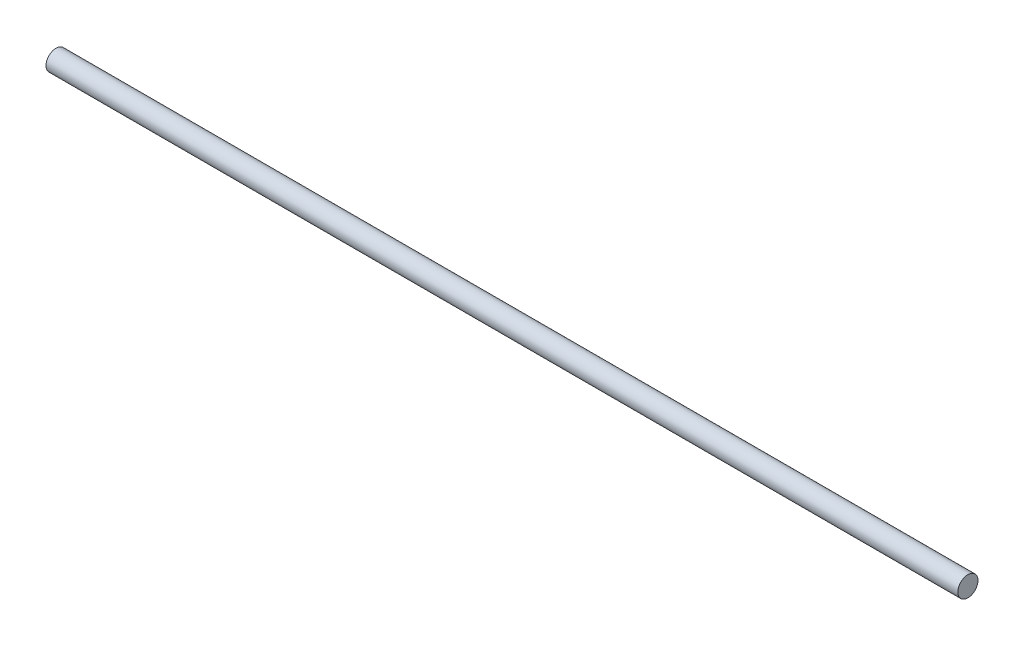
ISO-10303-21;
HEADER;
FILE_DESCRIPTION(('STEP AP214'),'2;1');
FILE_NAME('part.step','',(''),(''),'','','');
FILE_SCHEMA(('AUTOMOTIVE_DESIGN { 1 0 10303 214 1 1 1 1 }'));
ENDSEC;
DATA;
#1=APPLICATION_CONTEXT('core data for automotive mechanical design processes');
#2=APPLICATION_PROTOCOL_DEFINITION('international standard','automotive_design',2000,#1);
#3=PRODUCT_CONTEXT('',#1,'mechanical');
#4=PRODUCT('Part','Part','',(#3));
#5=PRODUCT_RELATED_PRODUCT_CATEGORY('part','',(#4));
#6=PRODUCT_DEFINITION_FORMATION('','',#4);
#7=PRODUCT_DEFINITION_CONTEXT('part definition',#1,'design');
#8=PRODUCT_DEFINITION('design','',#6,#7);
#9=PRODUCT_DEFINITION_SHAPE('','',#8);
#10=(LENGTH_UNIT() NAMED_UNIT(*) SI_UNIT(.MILLI.,.METRE.));
#11=(NAMED_UNIT(*) PLANE_ANGLE_UNIT() SI_UNIT($,.RADIAN.));
#12=(NAMED_UNIT(*) SI_UNIT($,.STERADIAN.) SOLID_ANGLE_UNIT());
#13=UNCERTAINTY_MEASURE_WITH_UNIT(LENGTH_MEASURE(1.E-05),#10,'distance_accuracy_value','');
#14=(GEOMETRIC_REPRESENTATION_CONTEXT(3) GLOBAL_UNCERTAINTY_ASSIGNED_CONTEXT((#13)) GLOBAL_UNIT_ASSIGNED_CONTEXT((#10,
#11,#12)) REPRESENTATION_CONTEXT('',''));
#15=CARTESIAN_POINT('',(0.,0.,0.));
#16=DIRECTION('',(0.,0.,1.));
#17=DIRECTION('',(1.,0.,0.));
#18=AXIS2_PLACEMENT_3D('',#15,#16,#17);
#19=CARTESIAN_POINT('',(181.,0.,0.));
#20=DIRECTION('',(-1.,0.,0.));
#21=DIRECTION('',(0.,0.,1.));
#22=AXIS2_PLACEMENT_3D('',#19,#20,#21);
#23=CYLINDRICAL_SURFACE('',#22,4.);
#24=CARTESIAN_POINT('',(181.,0.,0.));
#25=DIRECTION('',(1.,0.,0.));
#26=DIRECTION('',(0.,0.,-1.));
#27=AXIS2_PLACEMENT_3D('',#24,#25,#26);
#28=CIRCLE('',#27,4.);
#29=CARTESIAN_POINT('',(181.,0.,-4.));
#30=VERTEX_POINT('',#29);
#31=EDGE_CURVE('E10',#30,#30,#28,.T.);
#32=ORIENTED_EDGE('',*,*,#31,.F.);
#33=EDGE_LOOP('',(#32));
#34=FACE_BOUND('',#33,.T.);
#35=CARTESIAN_POINT('',(-181.,0.,0.));
#36=DIRECTION('',(1.,0.,0.));
#37=DIRECTION('',(0.,0.,-1.));
#38=AXIS2_PLACEMENT_3D('',#35,#36,#37);
#39=CIRCLE('',#38,4.);
#40=CARTESIAN_POINT('',(-181.,0.,-4.));
#41=VERTEX_POINT('',#40);
#42=EDGE_CURVE('E33',#41,#41,#39,.T.);
#43=ORIENTED_EDGE('',*,*,#42,.T.);
#44=EDGE_LOOP('',(#43));
#45=FACE_BOUND('',#44,.T.);
#46=ADVANCED_FACE('F30',(#34,#45),#23,.T.);
#47=CARTESIAN_POINT('',(181.,0.,0.));
#48=DIRECTION('',(1.,0.,0.));
#49=DIRECTION('',(0.,0.,-1.));
#50=AXIS2_PLACEMENT_3D('',#47,#48,#49);
#51=PLANE('',#50);
#52=ORIENTED_EDGE('',*,*,#31,.T.);
#53=EDGE_LOOP('',(#52));
#54=FACE_BOUND('',#53,.T.);
#55=ADVANCED_FACE('F45',(#54),#51,.T.);
#56=CARTESIAN_POINT('',(-181.,0.,0.));
#57=DIRECTION('',(1.,0.,0.));
#58=DIRECTION('',(0.,0.,-1.));
#59=AXIS2_PLACEMENT_3D('',#56,#57,#58);
#60=PLANE('',#59);
#61=ORIENTED_EDGE('',*,*,#42,.F.);
#62=EDGE_LOOP('',(#61));
#63=FACE_BOUND('',#62,.T.);
#64=ADVANCED_FACE('F43',(#63),#60,.F.);
#65=CLOSED_SHELL('',(#46,#55,#64));
#66=MANIFOLD_SOLID_BREP('B2',#65);
#67=ADVANCED_BREP_SHAPE_REPRESENTATION('',(#18,#66),#14);
#68=SHAPE_DEFINITION_REPRESENTATION(#9,#67);
ENDSEC;
END-ISO-10303-21;
